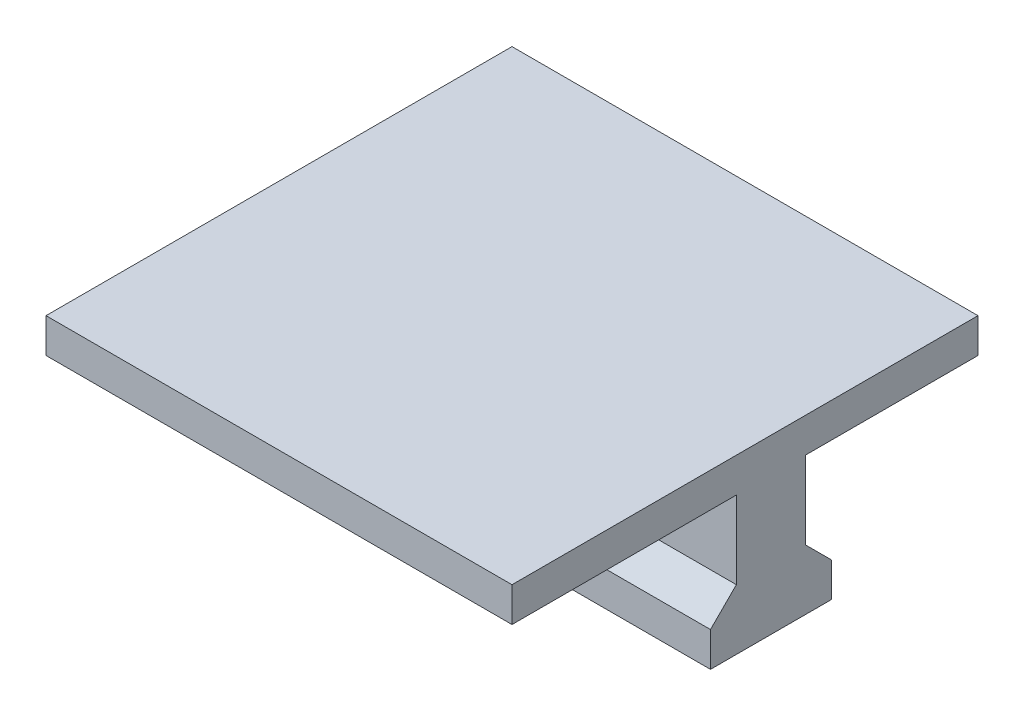
ISO-10303-21;
HEADER;
FILE_DESCRIPTION(('STEP AP214'),'2;1');
FILE_NAME('part.step','',(''),(''),'','','');
FILE_SCHEMA(('AUTOMOTIVE_DESIGN { 1 0 10303 214 1 1 1 1 }'));
ENDSEC;
DATA;
#1=APPLICATION_CONTEXT('core data for automotive mechanical design processes');
#2=APPLICATION_PROTOCOL_DEFINITION('international standard','automotive_design',2000,#1);
#3=PRODUCT_CONTEXT('',#1,'mechanical');
#4=PRODUCT('Part','Part','',(#3));
#5=PRODUCT_RELATED_PRODUCT_CATEGORY('part','',(#4));
#6=PRODUCT_DEFINITION_FORMATION('','',#4);
#7=PRODUCT_DEFINITION_CONTEXT('part definition',#1,'design');
#8=PRODUCT_DEFINITION('design','',#6,#7);
#9=PRODUCT_DEFINITION_SHAPE('','',#8);
#10=(LENGTH_UNIT() NAMED_UNIT(*) SI_UNIT(.MILLI.,.METRE.));
#11=(NAMED_UNIT(*) PLANE_ANGLE_UNIT() SI_UNIT($,.RADIAN.));
#12=(NAMED_UNIT(*) SI_UNIT($,.STERADIAN.) SOLID_ANGLE_UNIT());
#13=UNCERTAINTY_MEASURE_WITH_UNIT(LENGTH_MEASURE(1.E-05),#10,'distance_accuracy_value','');
#14=(GEOMETRIC_REPRESENTATION_CONTEXT(3) GLOBAL_UNCERTAINTY_ASSIGNED_CONTEXT((#13)) GLOBAL_UNIT_ASSIGNED_CONTEXT((#10,
#11,#12)) REPRESENTATION_CONTEXT('',''));
#15=CARTESIAN_POINT('',(0.,0.,0.));
#16=DIRECTION('',(0.,0.,1.));
#17=DIRECTION('',(1.,0.,0.));
#18=AXIS2_PLACEMENT_3D('',#15,#16,#17);
#19=CARTESIAN_POINT('',(0.,0.,0.));
#20=DIRECTION('',(0.,-1.,0.));
#21=DIRECTION('',(0.,0.,-1.));
#22=AXIS2_PLACEMENT_3D('',#19,#20,#21);
#23=PLANE('',#22);
#24=DIRECTION('',(1.,0.,0.));
#25=VECTOR('',#24,1.);
#26=CARTESIAN_POINT('',(-13.5,0.,-3.5));
#27=LINE('',#26,#25);
#28=CARTESIAN_POINT('',(-13.5,0.,-3.5));
#29=VERTEX_POINT('',#28);
#30=CARTESIAN_POINT('',(13.5,0.,-3.5));
#31=VERTEX_POINT('',#30);
#32=EDGE_CURVE('E184',#29,#31,#27,.T.);
#33=ORIENTED_EDGE('',*,*,#32,.F.);
#34=DIRECTION('',(0.,0.,1.));
#35=VECTOR('',#34,1.);
#36=CARTESIAN_POINT('',(-13.5,0.,13.5));
#37=LINE('',#36,#35);
#38=CARTESIAN_POINT('',(-13.5,0.,-13.5));
#39=VERTEX_POINT('',#38);
#40=EDGE_CURVE('E227',#39,#29,#37,.T.);
#41=ORIENTED_EDGE('',*,*,#40,.F.);
#42=DIRECTION('',(-1.,0.,0.));
#43=VECTOR('',#42,1.);
#44=CARTESIAN_POINT('',(-13.5,0.,-13.5));
#45=LINE('',#44,#43);
#46=CARTESIAN_POINT('',(13.5,0.,-13.5));
#47=VERTEX_POINT('',#46);
#48=EDGE_CURVE('E223',#47,#39,#45,.T.);
#49=ORIENTED_EDGE('',*,*,#48,.F.);
#50=DIRECTION('',(0.,0.,-1.));
#51=VECTOR('',#50,1.);
#52=CARTESIAN_POINT('',(13.5,0.,13.5));
#53=LINE('',#52,#51);
#54=EDGE_CURVE('E204',#31,#47,#53,.T.);
#55=ORIENTED_EDGE('',*,*,#54,.F.);
#56=EDGE_LOOP('',(#33,#41,#49,#55));
#57=FACE_BOUND('',#56,.T.);
#58=ADVANCED_FACE('F41',(#57),#23,.T.);
#59=CARTESIAN_POINT('',(13.5,2.,13.5));
#60=DIRECTION('',(-1.,0.,0.));
#61=DIRECTION('',(0.,0.,1.));
#62=AXIS2_PLACEMENT_3D('',#59,#60,#61);
#63=PLANE('',#62);
#64=DIRECTION('',(0.,1.,0.));
#65=VECTOR('',#64,1.);
#66=CARTESIAN_POINT('',(13.5,-8.,0.5));
#67=LINE('',#66,#65);
#68=CARTESIAN_POINT('',(13.5,-4.49999999999998,0.5));
#69=VERTEX_POINT('',#68);
#70=CARTESIAN_POINT('',(13.5,0.,0.5));
#71=VERTEX_POINT('',#70);
#72=EDGE_CURVE('E135',#69,#71,#67,.T.);
#73=ORIENTED_EDGE('',*,*,#72,.F.);
#74=DIRECTION('',(0.,-0.707106781186552,0.707106781186543));
#75=VECTOR('',#74,1.);
#76=CARTESIAN_POINT('',(13.5,-7.74999999999995,3.74999999999993));
#77=LINE('',#76,#75);
#78=CARTESIAN_POINT('',(13.5,-6.,2.));
#79=VERTEX_POINT('',#78);
#80=EDGE_CURVE('E129',#69,#79,#77,.T.);
#81=ORIENTED_EDGE('',*,*,#80,.T.);
#82=DIRECTION('',(0.,-1.,0.));
#83=VECTOR('',#82,1.);
#84=CARTESIAN_POINT('',(13.5,-6.,2.));
#85=LINE('',#84,#83);
#86=CARTESIAN_POINT('',(13.5,-8.,2.));
#87=VERTEX_POINT('',#86);
#88=EDGE_CURVE('E132',#79,#87,#85,.T.);
#89=ORIENTED_EDGE('',*,*,#88,.T.);
#90=DIRECTION('',(0.,0.,1.));
#91=VECTOR('',#90,1.);
#92=CARTESIAN_POINT('',(13.5,-8.,-3.5));
#93=LINE('',#92,#91);
#94=CARTESIAN_POINT('',(13.5,-8.,-5.));
#95=VERTEX_POINT('',#94);
#96=EDGE_CURVE('E180',#95,#87,#93,.T.);
#97=ORIENTED_EDGE('',*,*,#96,.F.);
#98=DIRECTION('',(0.,-1.,0.));
#99=VECTOR('',#98,1.);
#100=CARTESIAN_POINT('',(13.5,-6.,-5.));
#101=LINE('',#100,#99);
#102=CARTESIAN_POINT('',(13.5,-6.,-5.));
#103=VERTEX_POINT('',#102);
#104=EDGE_CURVE('E169',#103,#95,#101,.T.);
#105=ORIENTED_EDGE('',*,*,#104,.F.);
#106=DIRECTION('',(0.,0.707106781186552,0.707106781186543));
#107=VECTOR('',#106,1.);
#108=CARTESIAN_POINT('',(13.5,7.25000000000004,8.2499999999999));
#109=LINE('',#108,#107);
#110=CARTESIAN_POINT('',(13.5,-4.49999999999999,-3.5));
#111=VERTEX_POINT('',#110);
#112=EDGE_CURVE('E11',#103,#111,#109,.T.);
#113=ORIENTED_EDGE('',*,*,#112,.T.);
#114=DIRECTION('',(0.,1.,0.));
#115=VECTOR('',#114,1.);
#116=CARTESIAN_POINT('',(13.5,-8.,-3.5));
#117=LINE('',#116,#115);
#118=EDGE_CURVE('E187',#111,#31,#117,.T.);
#119=ORIENTED_EDGE('',*,*,#118,.T.);
#120=ORIENTED_EDGE('',*,*,#54,.T.);
#121=DIRECTION('',(0.,-1.,0.));
#122=VECTOR('',#121,1.);
#123=CARTESIAN_POINT('',(13.5,2.,-13.5));
#124=LINE('',#123,#122);
#125=CARTESIAN_POINT('',(13.5,2.,-13.5));
#126=VERTEX_POINT('',#125);
#127=EDGE_CURVE('E244',#126,#47,#124,.T.);
#128=ORIENTED_EDGE('',*,*,#127,.F.);
#129=DIRECTION('',(0.,0.,-1.));
#130=VECTOR('',#129,1.);
#131=CARTESIAN_POINT('',(13.5,2.,13.5));
#132=LINE('',#131,#130);
#133=CARTESIAN_POINT('',(13.5,2.,13.5));
#134=VERTEX_POINT('',#133);
#135=EDGE_CURVE('E205',#134,#126,#132,.T.);
#136=ORIENTED_EDGE('',*,*,#135,.F.);
#137=DIRECTION('',(0.,-1.,0.));
#138=VECTOR('',#137,1.);
#139=CARTESIAN_POINT('',(13.5,2.,13.5));
#140=LINE('',#139,#138);
#141=CARTESIAN_POINT('',(13.5,0.,13.5));
#142=VERTEX_POINT('',#141);
#143=EDGE_CURVE('E219',#134,#142,#140,.T.);
#144=ORIENTED_EDGE('',*,*,#143,.T.);
#145=EDGE_CURVE('E220',#142,#71,#53,.T.);
#146=ORIENTED_EDGE('',*,*,#145,.T.);
#147=EDGE_LOOP('',(#73,#81,#89,#97,#105,#113,#119,#120,#128,#136,#144,#146));
#148=FACE_BOUND('',#147,.T.);
#149=ADVANCED_FACE('F131',(#148),#63,.F.);
#150=CARTESIAN_POINT('',(-13.5,2.,-13.5));
#151=DIRECTION('',(0.,0.,1.));
#152=DIRECTION('',(1.,0.,0.));
#153=AXIS2_PLACEMENT_3D('',#150,#151,#152);
#154=PLANE('',#153);
#155=ORIENTED_EDGE('',*,*,#48,.T.);
#156=DIRECTION('',(0.,-1.,0.));
#157=VECTOR('',#156,1.);
#158=CARTESIAN_POINT('',(-13.5,2.,-13.5));
#159=LINE('',#158,#157);
#160=CARTESIAN_POINT('',(-13.5,2.,-13.5));
#161=VERTEX_POINT('',#160);
#162=EDGE_CURVE('E240',#161,#39,#159,.T.);
#163=ORIENTED_EDGE('',*,*,#162,.F.);
#164=DIRECTION('',(-1.,0.,0.));
#165=VECTOR('',#164,1.);
#166=CARTESIAN_POINT('',(-13.5,2.,-13.5));
#167=LINE('',#166,#165);
#168=EDGE_CURVE('E209',#126,#161,#167,.T.);
#169=ORIENTED_EDGE('',*,*,#168,.F.);
#170=ORIENTED_EDGE('',*,*,#127,.T.);
#171=EDGE_LOOP('',(#155,#163,#169,#170));
#172=FACE_BOUND('',#171,.T.);
#173=ADVANCED_FACE('F290',(#172),#154,.F.);
#174=CARTESIAN_POINT('',(-13.5,2.,13.5));
#175=DIRECTION('',(1.,0.,0.));
#176=DIRECTION('',(0.,0.,-1.));
#177=AXIS2_PLACEMENT_3D('',#174,#175,#176);
#178=PLANE('',#177);
#179=DIRECTION('',(0.,1.,0.));
#180=VECTOR('',#179,1.);
#181=CARTESIAN_POINT('',(-13.5,-8.,-3.5));
#182=LINE('',#181,#180);
#183=CARTESIAN_POINT('',(-13.5,-4.49999999999999,-3.5));
#184=VERTEX_POINT('',#183);
#185=EDGE_CURVE('E196',#184,#29,#182,.T.);
#186=ORIENTED_EDGE('',*,*,#185,.F.);
#187=DIRECTION('',(0.,-0.707106781186552,-0.707106781186543));
#188=VECTOR('',#187,1.);
#189=CARTESIAN_POINT('',(-13.5,7.25000000000004,8.2499999999999));
#190=LINE('',#189,#188);
#191=CARTESIAN_POINT('',(-13.5,-6.,-5.));
#192=VERTEX_POINT('',#191);
#193=EDGE_CURVE('E51',#184,#192,#190,.T.);
#194=ORIENTED_EDGE('',*,*,#193,.T.);
#195=DIRECTION('',(0.,-1.,0.));
#196=VECTOR('',#195,1.);
#197=CARTESIAN_POINT('',(-13.5,-6.,-5.));
#198=LINE('',#197,#196);
#199=CARTESIAN_POINT('',(-13.5,-8.,-5.));
#200=VERTEX_POINT('',#199);
#201=EDGE_CURVE('E174',#192,#200,#198,.T.);
#202=ORIENTED_EDGE('',*,*,#201,.T.);
#203=DIRECTION('',(0.,0.,-1.));
#204=VECTOR('',#203,1.);
#205=CARTESIAN_POINT('',(-13.5,-8.,-3.5));
#206=LINE('',#205,#204);
#207=CARTESIAN_POINT('',(-13.5,-8.,2.));
#208=VERTEX_POINT('',#207);
#209=EDGE_CURVE('E183',#208,#200,#206,.T.);
#210=ORIENTED_EDGE('',*,*,#209,.F.);
#211=DIRECTION('',(0.,-1.,0.));
#212=VECTOR('',#211,1.);
#213=CARTESIAN_POINT('',(-13.5,-6.,2.));
#214=LINE('',#213,#212);
#215=CARTESIAN_POINT('',(-13.5,-6.,2.));
#216=VERTEX_POINT('',#215);
#217=EDGE_CURVE('E153',#216,#208,#214,.T.);
#218=ORIENTED_EDGE('',*,*,#217,.F.);
#219=DIRECTION('',(0.,0.707106781186552,-0.707106781186543));
#220=VECTOR('',#219,1.);
#221=CARTESIAN_POINT('',(-13.5,-7.74999999999995,3.74999999999993));
#222=LINE('',#221,#220);
#223=CARTESIAN_POINT('',(-13.5,-4.49999999999998,0.5));
#224=VERTEX_POINT('',#223);
#225=EDGE_CURVE('E141',#216,#224,#222,.T.);
#226=ORIENTED_EDGE('',*,*,#225,.T.);
#227=DIRECTION('',(0.,1.,0.));
#228=VECTOR('',#227,1.);
#229=CARTESIAN_POINT('',(-13.5,-8.,0.5));
#230=LINE('',#229,#228);
#231=CARTESIAN_POINT('',(-13.5,0.,0.5));
#232=VERTEX_POINT('',#231);
#233=EDGE_CURVE('E199',#224,#232,#230,.T.);
#234=ORIENTED_EDGE('',*,*,#233,.T.);
#235=CARTESIAN_POINT('',(-13.5,0.,13.5));
#236=VERTEX_POINT('',#235);
#237=EDGE_CURVE('E226',#232,#236,#37,.T.);
#238=ORIENTED_EDGE('',*,*,#237,.T.);
#239=DIRECTION('',(0.,-1.,0.));
#240=VECTOR('',#239,1.);
#241=CARTESIAN_POINT('',(-13.5,2.,13.5));
#242=LINE('',#241,#240);
#243=CARTESIAN_POINT('',(-13.5,2.,13.5));
#244=VERTEX_POINT('',#243);
#245=EDGE_CURVE('E236',#244,#236,#242,.T.);
#246=ORIENTED_EDGE('',*,*,#245,.F.);
#247=DIRECTION('',(0.,0.,1.));
#248=VECTOR('',#247,1.);
#249=CARTESIAN_POINT('',(-13.5,2.,13.5));
#250=LINE('',#249,#248);
#251=EDGE_CURVE('E213',#161,#244,#250,.T.);
#252=ORIENTED_EDGE('',*,*,#251,.F.);
#253=ORIENTED_EDGE('',*,*,#162,.T.);
#254=ORIENTED_EDGE('',*,*,#40,.T.);
#255=EDGE_LOOP('',(#186,#194,#202,#210,#218,#226,#234,#238,#246,#252,#253,#254));
#256=FACE_BOUND('',#255,.T.);
#257=ADVANCED_FACE('F258',(#256),#178,.F.);
#258=CARTESIAN_POINT('',(-13.5,2.,13.5));
#259=DIRECTION('',(0.,0.,-1.));
#260=DIRECTION('',(-1.,0.,0.));
#261=AXIS2_PLACEMENT_3D('',#258,#259,#260);
#262=PLANE('',#261);
#263=DIRECTION('',(1.,0.,0.));
#264=VECTOR('',#263,1.);
#265=CARTESIAN_POINT('',(-13.5,0.,13.5));
#266=LINE('',#265,#264);
#267=EDGE_CURVE('E210',#236,#142,#266,.T.);
#268=ORIENTED_EDGE('',*,*,#267,.T.);
#269=ORIENTED_EDGE('',*,*,#143,.F.);
#270=DIRECTION('',(1.,0.,0.));
#271=VECTOR('',#270,1.);
#272=CARTESIAN_POINT('',(-13.5,2.,13.5));
#273=LINE('',#272,#271);
#274=EDGE_CURVE('E216',#244,#134,#273,.T.);
#275=ORIENTED_EDGE('',*,*,#274,.F.);
#276=ORIENTED_EDGE('',*,*,#245,.T.);
#277=EDGE_LOOP('',(#268,#269,#275,#276));
#278=FACE_BOUND('',#277,.T.);
#279=ADVANCED_FACE('F281',(#278),#262,.F.);
#280=CARTESIAN_POINT('',(0.,2.,0.));
#281=DIRECTION('',(0.,-1.,0.));
#282=DIRECTION('',(0.,0.,-1.));
#283=AXIS2_PLACEMENT_3D('',#280,#281,#282);
#284=PLANE('',#283);
#285=ORIENTED_EDGE('',*,*,#135,.T.);
#286=ORIENTED_EDGE('',*,*,#168,.T.);
#287=ORIENTED_EDGE('',*,*,#251,.T.);
#288=ORIENTED_EDGE('',*,*,#274,.T.);
#289=EDGE_LOOP('',(#285,#286,#287,#288));
#290=FACE_BOUND('',#289,.T.);
#291=ADVANCED_FACE('F287',(#290),#284,.F.);
#292=DIRECTION('',(-1.,0.,0.));
#293=VECTOR('',#292,1.);
#294=CARTESIAN_POINT('',(-13.5,0.,0.5));
#295=LINE('',#294,#293);
#296=EDGE_CURVE('E173',#71,#232,#295,.T.);
#297=ORIENTED_EDGE('',*,*,#296,.F.);
#298=ORIENTED_EDGE('',*,*,#145,.F.);
#299=ORIENTED_EDGE('',*,*,#267,.F.);
#300=ORIENTED_EDGE('',*,*,#237,.F.);
#301=EDGE_LOOP('',(#297,#298,#299,#300));
#302=FACE_BOUND('',#301,.T.);
#303=ADVANCED_FACE('F284',(#302),#23,.T.);
#304=CARTESIAN_POINT('',(-13.5,-8.,0.5));
#305=DIRECTION('',(0.,0.,-1.));
#306=DIRECTION('',(-1.,0.,0.));
#307=AXIS2_PLACEMENT_3D('',#304,#305,#306);
#308=PLANE('',#307);
#309=ORIENTED_EDGE('',*,*,#233,.F.);
#310=DIRECTION('',(1.,0.,0.));
#311=VECTOR('',#310,1.);
#312=CARTESIAN_POINT('',(-13.5,-4.49999999999998,0.5));
#313=LINE('',#312,#311);
#314=EDGE_CURVE('E248',#224,#69,#313,.T.);
#315=ORIENTED_EDGE('',*,*,#314,.T.);
#316=ORIENTED_EDGE('',*,*,#72,.T.);
#317=ORIENTED_EDGE('',*,*,#296,.T.);
#318=EDGE_LOOP('',(#309,#315,#316,#317));
#319=FACE_BOUND('',#318,.T.);
#320=ADVANCED_FACE('F306',(#319),#308,.F.);
#321=CARTESIAN_POINT('',(-13.5,-8.,-3.5));
#322=DIRECTION('',(0.,0.,1.));
#323=DIRECTION('',(1.,0.,0.));
#324=AXIS2_PLACEMENT_3D('',#321,#322,#323);
#325=PLANE('',#324);
#326=ORIENTED_EDGE('',*,*,#118,.F.);
#327=DIRECTION('',(-1.,0.,0.));
#328=VECTOR('',#327,1.);
#329=CARTESIAN_POINT('',(-13.5,-4.49999999999999,-3.5));
#330=LINE('',#329,#328);
#331=EDGE_CURVE('E142',#111,#184,#330,.T.);
#332=ORIENTED_EDGE('',*,*,#331,.T.);
#333=ORIENTED_EDGE('',*,*,#185,.T.);
#334=ORIENTED_EDGE('',*,*,#32,.T.);
#335=EDGE_LOOP('',(#326,#332,#333,#334));
#336=FACE_BOUND('',#335,.T.);
#337=ADVANCED_FACE('F263',(#336),#325,.F.);
#338=CARTESIAN_POINT('',(0.,-8.,0.));
#339=DIRECTION('',(0.,1.,0.));
#340=DIRECTION('',(0.,0.,1.));
#341=AXIS2_PLACEMENT_3D('',#338,#339,#340);
#342=PLANE('',#341);
#343=ORIENTED_EDGE('',*,*,#96,.T.);
#344=DIRECTION('',(-1.,0.,0.));
#345=VECTOR('',#344,1.);
#346=CARTESIAN_POINT('',(-13.5,-8.,2.));
#347=LINE('',#346,#345);
#348=EDGE_CURVE('E151',#87,#208,#347,.T.);
#349=ORIENTED_EDGE('',*,*,#348,.T.);
#350=ORIENTED_EDGE('',*,*,#209,.T.);
#351=DIRECTION('',(1.,0.,0.));
#352=VECTOR('',#351,1.);
#353=CARTESIAN_POINT('',(-13.5,-8.,-5.));
#354=LINE('',#353,#352);
#355=EDGE_CURVE('E158',#200,#95,#354,.T.);
#356=ORIENTED_EDGE('',*,*,#355,.T.);
#357=EDGE_LOOP('',(#343,#349,#350,#356));
#358=FACE_BOUND('',#357,.T.);
#359=ADVANCED_FACE('F319',(#358),#342,.F.);
#360=CARTESIAN_POINT('',(-13.5,-6.,-5.));
#361=DIRECTION('',(0.,0.,-1.));
#362=DIRECTION('',(-1.,0.,0.));
#363=AXIS2_PLACEMENT_3D('',#360,#361,#362);
#364=PLANE('',#363);
#365=ORIENTED_EDGE('',*,*,#355,.F.);
#366=ORIENTED_EDGE('',*,*,#201,.F.);
#367=DIRECTION('',(1.,0.,0.));
#368=VECTOR('',#367,1.);
#369=CARTESIAN_POINT('',(-13.5,-6.,-5.));
#370=LINE('',#369,#368);
#371=EDGE_CURVE('E154',#192,#103,#370,.T.);
#372=ORIENTED_EDGE('',*,*,#371,.T.);
#373=ORIENTED_EDGE('',*,*,#104,.T.);
#374=EDGE_LOOP('',(#365,#366,#372,#373));
#375=FACE_BOUND('',#374,.T.);
#376=ADVANCED_FACE('F261',(#375),#364,.T.);
#377=CARTESIAN_POINT('',(-13.5,-6.,2.));
#378=DIRECTION('',(0.,0.,1.));
#379=DIRECTION('',(1.,0.,0.));
#380=AXIS2_PLACEMENT_3D('',#377,#378,#379);
#381=PLANE('',#380);
#382=ORIENTED_EDGE('',*,*,#348,.F.);
#383=ORIENTED_EDGE('',*,*,#88,.F.);
#384=DIRECTION('',(-1.,0.,0.));
#385=VECTOR('',#384,1.);
#386=CARTESIAN_POINT('',(-13.5,-6.,2.));
#387=LINE('',#386,#385);
#388=EDGE_CURVE('E148',#79,#216,#387,.T.);
#389=ORIENTED_EDGE('',*,*,#388,.T.);
#390=ORIENTED_EDGE('',*,*,#217,.T.);
#391=EDGE_LOOP('',(#382,#383,#389,#390));
#392=FACE_BOUND('',#391,.T.);
#393=ADVANCED_FACE('F146',(#392),#381,.T.);
#394=CARTESIAN_POINT('',(-13.5,-4.49999999999998,0.5));
#395=DIRECTION('',(0.,-0.707106781186543,-0.707106781186552));
#396=DIRECTION('',(1.,0.,0.));
#397=AXIS2_PLACEMENT_3D('',#394,#395,#396);
#398=PLANE('',#397);
#399=ORIENTED_EDGE('',*,*,#225,.F.);
#400=ORIENTED_EDGE('',*,*,#388,.F.);
#401=ORIENTED_EDGE('',*,*,#80,.F.);
#402=ORIENTED_EDGE('',*,*,#314,.F.);
#403=EDGE_LOOP('',(#399,#400,#401,#402));
#404=FACE_BOUND('',#403,.T.);
#405=ADVANCED_FACE('F156',(#404),#398,.F.);
#406=CARTESIAN_POINT('',(-13.5,-4.49999999999999,-3.5));
#407=DIRECTION('',(0.,-0.707106781186543,0.707106781186552));
#408=DIRECTION('',(-1.,0.,0.));
#409=AXIS2_PLACEMENT_3D('',#406,#407,#408);
#410=PLANE('',#409);
#411=ORIENTED_EDGE('',*,*,#112,.F.);
#412=ORIENTED_EDGE('',*,*,#371,.F.);
#413=ORIENTED_EDGE('',*,*,#193,.F.);
#414=ORIENTED_EDGE('',*,*,#331,.F.);
#415=EDGE_LOOP('',(#411,#412,#413,#414));
#416=FACE_BOUND('',#415,.T.);
#417=ADVANCED_FACE('F44',(#416),#410,.F.);
#418=CLOSED_SHELL('',(#58,#149,#173,#257,#279,#291,#303,#320,#337,#359,#376,#393,#405,#417));
#419=MANIFOLD_SOLID_BREP('B2',#418);
#420=ADVANCED_BREP_SHAPE_REPRESENTATION('',(#18,#419),#14);
#421=SHAPE_DEFINITION_REPRESENTATION(#9,#420);
ENDSEC;
END-ISO-10303-21;
